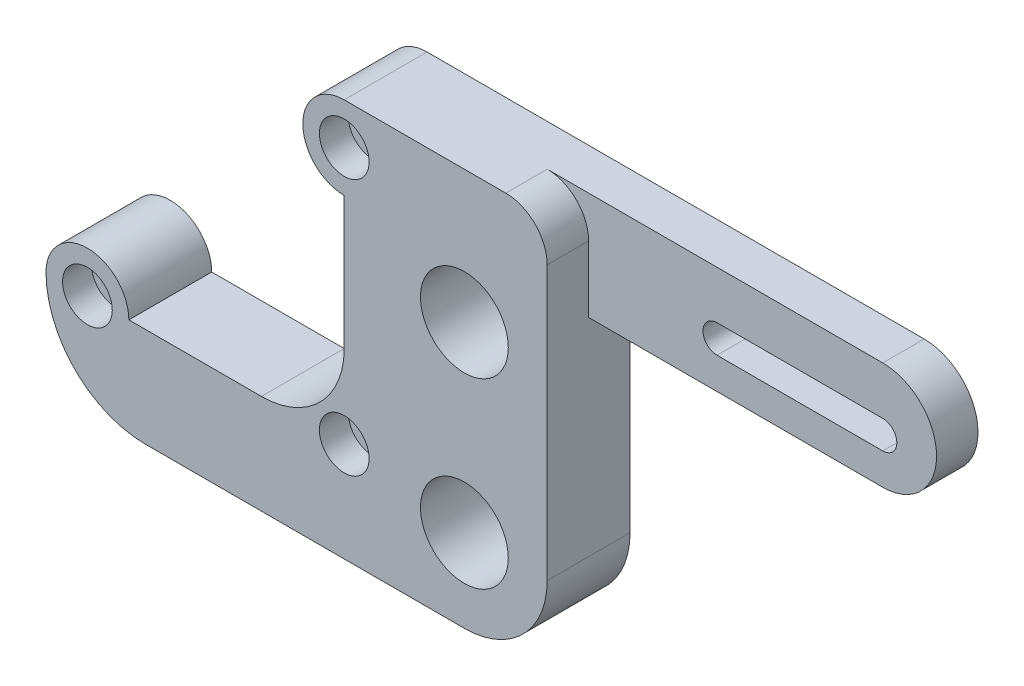
ISO-10303-21;
HEADER;
FILE_DESCRIPTION(('STEP AP214'),'2;1');
FILE_NAME('part.step','',(''),(''),'','','');
FILE_SCHEMA(('AUTOMOTIVE_DESIGN { 1 0 10303 214 1 1 1 1 }'));
ENDSEC;
DATA;
#1=APPLICATION_CONTEXT('core data for automotive mechanical design processes');
#2=APPLICATION_PROTOCOL_DEFINITION('international standard','automotive_design',2000,#1);
#3=PRODUCT_CONTEXT('',#1,'mechanical');
#4=PRODUCT('Part','Part','',(#3));
#5=PRODUCT_RELATED_PRODUCT_CATEGORY('part','',(#4));
#6=PRODUCT_DEFINITION_FORMATION('','',#4);
#7=PRODUCT_DEFINITION_CONTEXT('part definition',#1,'design');
#8=PRODUCT_DEFINITION('design','',#6,#7);
#9=PRODUCT_DEFINITION_SHAPE('','',#8);
#10=(LENGTH_UNIT() NAMED_UNIT(*) SI_UNIT(.MILLI.,.METRE.));
#11=(NAMED_UNIT(*) PLANE_ANGLE_UNIT() SI_UNIT($,.RADIAN.));
#12=(NAMED_UNIT(*) SI_UNIT($,.STERADIAN.) SOLID_ANGLE_UNIT());
#13=UNCERTAINTY_MEASURE_WITH_UNIT(LENGTH_MEASURE(1.E-05),#10,'distance_accuracy_value','');
#14=(GEOMETRIC_REPRESENTATION_CONTEXT(3) GLOBAL_UNCERTAINTY_ASSIGNED_CONTEXT((#13)) GLOBAL_UNIT_ASSIGNED_CONTEXT((#10,
#11,#12)) REPRESENTATION_CONTEXT('',''));
#15=CARTESIAN_POINT('',(0.,0.,0.));
#16=DIRECTION('',(0.,0.,1.));
#17=DIRECTION('',(1.,0.,0.));
#18=AXIS2_PLACEMENT_3D('',#15,#16,#17);
#19=CARTESIAN_POINT('',(0.,5.,10.));
#20=DIRECTION('',(0.,1.,0.));
#21=DIRECTION('',(0.,0.,1.));
#22=AXIS2_PLACEMENT_3D('',#19,#20,#21);
#23=PLANE('',#22);
#24=DIRECTION('',(1.,0.,0.));
#25=VECTOR('',#24,1.);
#26=CARTESIAN_POINT('',(0.,5.,10.));
#27=LINE('',#26,#25);
#28=CARTESIAN_POINT('',(0.,5.,10.));
#29=VERTEX_POINT('',#28);
#30=CARTESIAN_POINT('',(19.5,5.,10.));
#31=VERTEX_POINT('',#30);
#32=EDGE_CURVE('E252',#29,#31,#27,.T.);
#33=ORIENTED_EDGE('',*,*,#32,.T.);
#34=DIRECTION('',(0.,0.,1.));
#35=VECTOR('',#34,1.);
#36=CARTESIAN_POINT('',(19.5,5.,5.));
#37=LINE('',#36,#35);
#38=CARTESIAN_POINT('',(19.5,5.,5.));
#39=VERTEX_POINT('',#38);
#40=EDGE_CURVE('E57',#39,#31,#37,.T.);
#41=ORIENTED_EDGE('',*,*,#40,.F.);
#42=DIRECTION('',(-1.,0.,0.));
#43=VECTOR('',#42,1.);
#44=CARTESIAN_POINT('',(19.5,5.,5.));
#45=LINE('',#44,#43);
#46=CARTESIAN_POINT('',(60.,5.,5.));
#47=VERTEX_POINT('',#46);
#48=EDGE_CURVE('E180',#47,#39,#45,.T.);
#49=ORIENTED_EDGE('',*,*,#48,.F.);
#50=DIRECTION('',(0.,0.,-1.));
#51=VECTOR('',#50,1.);
#52=CARTESIAN_POINT('',(60.,5.,10.));
#53=LINE('',#52,#51);
#54=CARTESIAN_POINT('',(60.,5.,0.));
#55=VERTEX_POINT('',#54);
#56=EDGE_CURVE('E179',#47,#55,#53,.T.);
#57=ORIENTED_EDGE('',*,*,#56,.T.);
#58=DIRECTION('',(1.,0.,0.));
#59=VECTOR('',#58,1.);
#60=CARTESIAN_POINT('',(0.,5.,0.));
#61=LINE('',#60,#59);
#62=CARTESIAN_POINT('',(0.,5.,0.));
#63=VERTEX_POINT('',#62);
#64=EDGE_CURVE('E307',#63,#55,#61,.T.);
#65=ORIENTED_EDGE('',*,*,#64,.F.);
#66=DIRECTION('',(0.,0.,-1.));
#67=VECTOR('',#66,1.);
#68=CARTESIAN_POINT('',(0.,5.,10.));
#69=LINE('',#68,#67);
#70=EDGE_CURVE('E190',#29,#63,#69,.T.);
#71=ORIENTED_EDGE('',*,*,#70,.F.);
#72=EDGE_LOOP('',(#33,#41,#49,#57,#65,#71));
#73=FACE_BOUND('',#72,.T.);
#74=ADVANCED_FACE('F35',(#73),#23,.T.);
#75=CARTESIAN_POINT('',(0.,-31.,10.));
#76=DIRECTION('',(0.,0.,-1.));
#77=DIRECTION('',(-1.,0.,0.));
#78=AXIS2_PLACEMENT_3D('',#75,#76,#77);
#79=CYLINDRICAL_SURFACE('',#78,1.8);
#80=CARTESIAN_POINT('',(0.,-31.,0.));
#81=DIRECTION('',(0.,0.,1.));
#82=DIRECTION('',(1.,0.,0.));
#83=AXIS2_PLACEMENT_3D('',#80,#81,#82);
#84=CIRCLE('',#83,1.8);
#85=CARTESIAN_POINT('',(1.8,-31.,0.));
#86=VERTEX_POINT('',#85);
#87=EDGE_CURVE('E283',#86,#86,#84,.T.);
#88=ORIENTED_EDGE('',*,*,#87,.F.);
#89=EDGE_LOOP('',(#88));
#90=FACE_BOUND('',#89,.T.);
#91=CARTESIAN_POINT('',(0.,-31.,6.5));
#92=DIRECTION('',(0.,0.,1.));
#93=DIRECTION('',(1.,0.,0.));
#94=AXIS2_PLACEMENT_3D('',#91,#92,#93);
#95=CIRCLE('',#94,1.8);
#96=CARTESIAN_POINT('',(1.8,-31.,6.5));
#97=VERTEX_POINT('',#96);
#98=EDGE_CURVE('E218',#97,#97,#95,.T.);
#99=ORIENTED_EDGE('',*,*,#98,.T.);
#100=EDGE_LOOP('',(#99));
#101=FACE_BOUND('',#100,.T.);
#102=ADVANCED_FACE('F442',(#90,#101),#79,.F.);
#103=CARTESIAN_POINT('',(0.,0.,10.));
#104=DIRECTION('',(0.,0.,-1.));
#105=DIRECTION('',(-1.,0.,0.));
#106=AXIS2_PLACEMENT_3D('',#103,#104,#105);
#107=CYLINDRICAL_SURFACE('',#106,1.8);
#108=CARTESIAN_POINT('',(0.,0.,0.));
#109=DIRECTION('',(0.,0.,1.));
#110=DIRECTION('',(1.,0.,0.));
#111=AXIS2_PLACEMENT_3D('',#108,#109,#110);
#112=CIRCLE('',#111,1.8);
#113=CARTESIAN_POINT('',(1.8,0.,0.));
#114=VERTEX_POINT('',#113);
#115=EDGE_CURVE('E214',#114,#114,#112,.T.);
#116=ORIENTED_EDGE('',*,*,#115,.F.);
#117=EDGE_LOOP('',(#116));
#118=FACE_BOUND('',#117,.T.);
#119=CARTESIAN_POINT('',(0.,0.,6.5));
#120=DIRECTION('',(0.,0.,1.));
#121=DIRECTION('',(1.,0.,0.));
#122=AXIS2_PLACEMENT_3D('',#119,#120,#121);
#123=CIRCLE('',#122,1.8);
#124=CARTESIAN_POINT('',(1.8,0.,6.5));
#125=VERTEX_POINT('',#124);
#126=EDGE_CURVE('E216',#125,#125,#123,.T.);
#127=ORIENTED_EDGE('',*,*,#126,.T.);
#128=EDGE_LOOP('',(#127));
#129=FACE_BOUND('',#128,.T.);
#130=ADVANCED_FACE('F37',(#118,#129),#107,.F.);
#131=CARTESIAN_POINT('',(-31.,-31.,10.));
#132=DIRECTION('',(0.,0.,-1.));
#133=DIRECTION('',(-1.,0.,0.));
#134=AXIS2_PLACEMENT_3D('',#131,#132,#133);
#135=CYLINDRICAL_SURFACE('',#134,1.8);
#136=CARTESIAN_POINT('',(-31.,-31.,0.));
#137=DIRECTION('',(0.,0.,1.));
#138=DIRECTION('',(1.,0.,0.));
#139=AXIS2_PLACEMENT_3D('',#136,#137,#138);
#140=CIRCLE('',#139,1.8);
#141=CARTESIAN_POINT('',(-29.2,-31.,0.));
#142=VERTEX_POINT('',#141);
#143=EDGE_CURVE('E286',#142,#142,#140,.T.);
#144=ORIENTED_EDGE('',*,*,#143,.F.);
#145=EDGE_LOOP('',(#144));
#146=FACE_BOUND('',#145,.T.);
#147=CARTESIAN_POINT('',(-31.,-31.,6.5));
#148=DIRECTION('',(0.,0.,1.));
#149=DIRECTION('',(1.,0.,0.));
#150=AXIS2_PLACEMENT_3D('',#147,#148,#149);
#151=CIRCLE('',#150,1.8);
#152=CARTESIAN_POINT('',(-29.2,-31.,6.5));
#153=VERTEX_POINT('',#152);
#154=EDGE_CURVE('E211',#153,#153,#151,.T.);
#155=ORIENTED_EDGE('',*,*,#154,.T.);
#156=EDGE_LOOP('',(#155));
#157=FACE_BOUND('',#156,.T.);
#158=ADVANCED_FACE('F425',(#146,#157),#135,.F.);
#159=CARTESIAN_POINT('',(-31.,-31.,10.));
#160=DIRECTION('',(0.,0.,-1.));
#161=DIRECTION('',(-1.,0.,0.));
#162=AXIS2_PLACEMENT_3D('',#159,#160,#161);
#163=CYLINDRICAL_SURFACE('',#162,5.00000000000001);
#164=CARTESIAN_POINT('',(-31.,-31.,0.));
#165=DIRECTION('',(0.,0.,1.));
#166=DIRECTION('',(1.,0.,0.));
#167=AXIS2_PLACEMENT_3D('',#164,#165,#166);
#168=CIRCLE('',#167,5.00000000000001);
#169=CARTESIAN_POINT('',(-26.,-31.,0.));
#170=VERTEX_POINT('',#169);
#171=CARTESIAN_POINT('',(-36.,-31.,0.));
#172=VERTEX_POINT('',#171);
#173=EDGE_CURVE('E289',#170,#172,#168,.T.);
#174=ORIENTED_EDGE('',*,*,#173,.T.);
#175=DIRECTION('',(0.,0.,-1.));
#176=VECTOR('',#175,1.);
#177=CARTESIAN_POINT('',(-36.,-31.,10.));
#178=LINE('',#177,#176);
#179=CARTESIAN_POINT('',(-36.,-31.,10.));
#180=VERTEX_POINT('',#179);
#181=EDGE_CURVE('E43',#180,#172,#178,.T.);
#182=ORIENTED_EDGE('',*,*,#181,.F.);
#183=CARTESIAN_POINT('',(-31.,-31.,10.));
#184=DIRECTION('',(0.,0.,1.));
#185=DIRECTION('',(1.,0.,0.));
#186=AXIS2_PLACEMENT_3D('',#183,#184,#185);
#187=CIRCLE('',#186,5.00000000000001);
#188=CARTESIAN_POINT('',(-26.,-31.,10.));
#189=VERTEX_POINT('',#188);
#190=EDGE_CURVE('E239',#189,#180,#187,.T.);
#191=ORIENTED_EDGE('',*,*,#190,.F.);
#192=DIRECTION('',(0.,0.,-1.));
#193=VECTOR('',#192,1.);
#194=CARTESIAN_POINT('',(-26.,-31.,10.));
#195=LINE('',#194,#193);
#196=EDGE_CURVE('E210',#189,#170,#195,.T.);
#197=ORIENTED_EDGE('',*,*,#196,.T.);
#198=EDGE_LOOP('',(#174,#182,#191,#197));
#199=FACE_BOUND('',#198,.T.);
#200=ADVANCED_FACE('F359',(#199),#163,.T.);
#201=CARTESIAN_POINT('',(-24.,-31.,10.));
#202=DIRECTION('',(0.,0.,-1.));
#203=DIRECTION('',(-1.,0.,0.));
#204=AXIS2_PLACEMENT_3D('',#201,#202,#203);
#205=CYLINDRICAL_SURFACE('',#204,12.);
#206=CARTESIAN_POINT('',(-24.,-31.,0.));
#207=DIRECTION('',(0.,0.,1.));
#208=DIRECTION('',(1.,0.,0.));
#209=AXIS2_PLACEMENT_3D('',#206,#207,#208);
#210=CIRCLE('',#209,12.);
#211=CARTESIAN_POINT('',(-24.,-43.,0.));
#212=VERTEX_POINT('',#211);
#213=EDGE_CURVE('E292',#172,#212,#210,.T.);
#214=ORIENTED_EDGE('',*,*,#213,.T.);
#215=DIRECTION('',(0.,0.,-1.));
#216=VECTOR('',#215,1.);
#217=CARTESIAN_POINT('',(-24.,-43.,10.));
#218=LINE('',#217,#216);
#219=CARTESIAN_POINT('',(-24.,-43.,10.));
#220=VERTEX_POINT('',#219);
#221=EDGE_CURVE('E197',#220,#212,#218,.T.);
#222=ORIENTED_EDGE('',*,*,#221,.F.);
#223=CARTESIAN_POINT('',(-24.,-31.,10.));
#224=DIRECTION('',(0.,0.,1.));
#225=DIRECTION('',(1.,0.,0.));
#226=AXIS2_PLACEMENT_3D('',#223,#224,#225);
#227=CIRCLE('',#226,12.);
#228=EDGE_CURVE('E242',#180,#220,#227,.T.);
#229=ORIENTED_EDGE('',*,*,#228,.F.);
#230=ORIENTED_EDGE('',*,*,#181,.T.);
#231=EDGE_LOOP('',(#214,#222,#229,#230));
#232=FACE_BOUND('',#231,.T.);
#233=ADVANCED_FACE('F356',(#232),#205,.T.);
#234=CARTESIAN_POINT('',(0.,-43.,10.));
#235=DIRECTION('',(0.,-1.,0.));
#236=DIRECTION('',(1.,0.,0.));
#237=AXIS2_PLACEMENT_3D('',#234,#235,#236);
#238=PLANE('',#237);
#239=DIRECTION('',(-1.,0.,0.));
#240=VECTOR('',#239,1.);
#241=CARTESIAN_POINT('',(0.,-43.,0.));
#242=LINE('',#241,#240);
#243=CARTESIAN_POINT('',(14.5,-43.,0.));
#244=VERTEX_POINT('',#243);
#245=EDGE_CURVE('E295',#244,#212,#242,.T.);
#246=ORIENTED_EDGE('',*,*,#245,.F.);
#247=DIRECTION('',(0.,0.,-1.));
#248=VECTOR('',#247,1.);
#249=CARTESIAN_POINT('',(14.5,-43.,10.));
#250=LINE('',#249,#248);
#251=CARTESIAN_POINT('',(14.5,-43.,10.));
#252=VERTEX_POINT('',#251);
#253=EDGE_CURVE('E195',#252,#244,#250,.T.);
#254=ORIENTED_EDGE('',*,*,#253,.F.);
#255=DIRECTION('',(-1.,0.,0.));
#256=VECTOR('',#255,1.);
#257=CARTESIAN_POINT('',(0.,-43.,10.));
#258=LINE('',#257,#256);
#259=EDGE_CURVE('E244',#252,#220,#258,.T.);
#260=ORIENTED_EDGE('',*,*,#259,.T.);
#261=ORIENTED_EDGE('',*,*,#221,.T.);
#262=EDGE_LOOP('',(#246,#254,#260,#261));
#263=FACE_BOUND('',#262,.T.);
#264=ADVANCED_FACE('F351',(#263),#238,.T.);
#265=CARTESIAN_POINT('',(14.5,-33.,10.));
#266=DIRECTION('',(0.,0.,-1.));
#267=DIRECTION('',(-1.,0.,0.));
#268=AXIS2_PLACEMENT_3D('',#265,#266,#267);
#269=CYLINDRICAL_SURFACE('',#268,10.);
#270=CARTESIAN_POINT('',(14.5,-33.,0.));
#271=DIRECTION('',(0.,0.,1.));
#272=DIRECTION('',(1.,0.,0.));
#273=AXIS2_PLACEMENT_3D('',#270,#271,#272);
#274=CIRCLE('',#273,10.);
#275=CARTESIAN_POINT('',(24.5,-33.,0.));
#276=VERTEX_POINT('',#275);
#277=EDGE_CURVE('E298',#244,#276,#274,.T.);
#278=ORIENTED_EDGE('',*,*,#277,.T.);
#279=DIRECTION('',(0.,0.,-1.));
#280=VECTOR('',#279,1.);
#281=CARTESIAN_POINT('',(24.5,-33.,10.));
#282=LINE('',#281,#280);
#283=CARTESIAN_POINT('',(24.5,-33.,10.));
#284=VERTEX_POINT('',#283);
#285=EDGE_CURVE('E188',#284,#276,#282,.T.);
#286=ORIENTED_EDGE('',*,*,#285,.F.);
#287=CARTESIAN_POINT('',(14.5,-33.,10.));
#288=DIRECTION('',(0.,0.,1.));
#289=DIRECTION('',(1.,0.,0.));
#290=AXIS2_PLACEMENT_3D('',#287,#288,#289);
#291=CIRCLE('',#290,10.);
#292=EDGE_CURVE('E247',#252,#284,#291,.T.);
#293=ORIENTED_EDGE('',*,*,#292,.F.);
#294=ORIENTED_EDGE('',*,*,#253,.T.);
#295=EDGE_LOOP('',(#278,#286,#293,#294));
#296=FACE_BOUND('',#295,.T.);
#297=ADVANCED_FACE('F348',(#296),#269,.T.);
#298=CARTESIAN_POINT('',(24.5,0.,10.));
#299=DIRECTION('',(1.,0.,0.));
#300=DIRECTION('',(0.,0.,-1.));
#301=AXIS2_PLACEMENT_3D('',#298,#299,#300);
#302=PLANE('',#301);
#303=DIRECTION('',(0.,-1.,0.));
#304=VECTOR('',#303,1.);
#305=CARTESIAN_POINT('',(24.5,0.,0.));
#306=LINE('',#305,#304);
#307=CARTESIAN_POINT('',(24.5,-8.,0.));
#308=VERTEX_POINT('',#307);
#309=EDGE_CURVE('E301',#308,#276,#306,.T.);
#310=ORIENTED_EDGE('',*,*,#309,.F.);
#311=DIRECTION('',(0.,0.,-1.));
#312=VECTOR('',#311,1.);
#313=CARTESIAN_POINT('',(24.5,-8.,10.));
#314=LINE('',#313,#312);
#315=CARTESIAN_POINT('',(24.5,-8.,5.));
#316=VERTEX_POINT('',#315);
#317=EDGE_CURVE('E186',#316,#308,#314,.T.);
#318=ORIENTED_EDGE('',*,*,#317,.F.);
#319=DIRECTION('',(0.,-1.,0.));
#320=VECTOR('',#319,1.);
#321=CARTESIAN_POINT('',(24.5,-8.,5.));
#322=LINE('',#321,#320);
#323=CARTESIAN_POINT('',(24.5,0.,5.));
#324=VERTEX_POINT('',#323);
#325=EDGE_CURVE('E167',#324,#316,#322,.T.);
#326=ORIENTED_EDGE('',*,*,#325,.F.);
#327=DIRECTION('',(0.,0.,1.));
#328=VECTOR('',#327,1.);
#329=CARTESIAN_POINT('',(24.5,0.,5.));
#330=LINE('',#329,#328);
#331=CARTESIAN_POINT('',(24.5,0.,10.));
#332=VERTEX_POINT('',#331);
#333=EDGE_CURVE('E375',#324,#332,#330,.T.);
#334=ORIENTED_EDGE('',*,*,#333,.T.);
#335=DIRECTION('',(0.,-1.,0.));
#336=VECTOR('',#335,1.);
#337=CARTESIAN_POINT('',(24.5,0.,10.));
#338=LINE('',#337,#336);
#339=EDGE_CURVE('E249',#332,#284,#338,.T.);
#340=ORIENTED_EDGE('',*,*,#339,.T.);
#341=ORIENTED_EDGE('',*,*,#285,.T.);
#342=EDGE_LOOP('',(#310,#318,#326,#334,#340,#341));
#343=FACE_BOUND('',#342,.T.);
#344=ADVANCED_FACE('F343',(#343),#302,.T.);
#345=CARTESIAN_POINT('',(0.,-8.,10.));
#346=DIRECTION('',(0.,-1.,0.));
#347=DIRECTION('',(1.,0.,0.));
#348=AXIS2_PLACEMENT_3D('',#345,#346,#347);
#349=PLANE('',#348);
#350=DIRECTION('',(1.,0.,0.));
#351=VECTOR('',#350,1.);
#352=CARTESIAN_POINT('',(24.5,-8.,5.));
#353=LINE('',#352,#351);
#354=CARTESIAN_POINT('',(60.,-8.,5.));
#355=VERTEX_POINT('',#354);
#356=EDGE_CURVE('E159',#316,#355,#353,.T.);
#357=ORIENTED_EDGE('',*,*,#356,.F.);
#358=ORIENTED_EDGE('',*,*,#317,.T.);
#359=DIRECTION('',(-1.,0.,0.));
#360=VECTOR('',#359,1.);
#361=CARTESIAN_POINT('',(0.,-8.,0.));
#362=LINE('',#361,#360);
#363=CARTESIAN_POINT('',(60.,-8.,0.));
#364=VERTEX_POINT('',#363);
#365=EDGE_CURVE('E185',#364,#308,#362,.T.);
#366=ORIENTED_EDGE('',*,*,#365,.F.);
#367=DIRECTION('',(0.,0.,-1.));
#368=VECTOR('',#367,1.);
#369=CARTESIAN_POINT('',(60.,-8.,10.));
#370=LINE('',#369,#368);
#371=EDGE_CURVE('E177',#355,#364,#370,.T.);
#372=ORIENTED_EDGE('',*,*,#371,.F.);
#373=EDGE_LOOP('',(#357,#358,#366,#372));
#374=FACE_BOUND('',#373,.T.);
#375=ADVANCED_FACE('F183',(#374),#349,.T.);
#376=CARTESIAN_POINT('',(60.,-1.5,10.));
#377=DIRECTION('',(0.,0.,-1.));
#378=DIRECTION('',(-1.,0.,0.));
#379=AXIS2_PLACEMENT_3D('',#376,#377,#378);
#380=CYLINDRICAL_SURFACE('',#379,6.5);
#381=ORIENTED_EDGE('',*,*,#56,.F.);
#382=CARTESIAN_POINT('',(60.,-1.5,5.));
#383=DIRECTION('',(0.,0.,1.));
#384=DIRECTION('',(-1.,0.,0.));
#385=AXIS2_PLACEMENT_3D('',#382,#383,#384);
#386=CIRCLE('',#385,6.5);
#387=EDGE_CURVE('E163',#355,#47,#386,.T.);
#388=ORIENTED_EDGE('',*,*,#387,.F.);
#389=ORIENTED_EDGE('',*,*,#371,.T.);
#390=CARTESIAN_POINT('',(60.,-1.5,0.));
#391=DIRECTION('',(0.,0.,1.));
#392=DIRECTION('',(1.,0.,0.));
#393=AXIS2_PLACEMENT_3D('',#390,#391,#392);
#394=CIRCLE('',#393,6.5);
#395=EDGE_CURVE('E305',#364,#55,#394,.T.);
#396=ORIENTED_EDGE('',*,*,#395,.T.);
#397=EDGE_LOOP('',(#381,#388,#389,#396));
#398=FACE_BOUND('',#397,.T.);
#399=ADVANCED_FACE('F175',(#398),#380,.T.);
#400=CARTESIAN_POINT('',(0.,0.,10.));
#401=DIRECTION('',(0.,0.,-1.));
#402=DIRECTION('',(-1.,0.,0.));
#403=AXIS2_PLACEMENT_3D('',#400,#401,#402);
#404=CYLINDRICAL_SURFACE('',#403,5.);
#405=CARTESIAN_POINT('',(0.,0.,0.));
#406=DIRECTION('',(0.,0.,1.));
#407=DIRECTION('',(1.,0.,0.));
#408=AXIS2_PLACEMENT_3D('',#405,#406,#407);
#409=CIRCLE('',#408,5.);
#410=CARTESIAN_POINT('',(0.,-5.,0.));
#411=VERTEX_POINT('',#410);
#412=EDGE_CURVE('E310',#63,#411,#409,.T.);
#413=ORIENTED_EDGE('',*,*,#412,.T.);
#414=DIRECTION('',(0.,0.,-1.));
#415=VECTOR('',#414,1.);
#416=CARTESIAN_POINT('',(0.,-5.,10.));
#417=LINE('',#416,#415);
#418=CARTESIAN_POINT('',(0.,-5.,10.));
#419=VERTEX_POINT('',#418);
#420=EDGE_CURVE('E325',#419,#411,#417,.T.);
#421=ORIENTED_EDGE('',*,*,#420,.F.);
#422=CARTESIAN_POINT('',(0.,0.,10.));
#423=DIRECTION('',(0.,0.,1.));
#424=DIRECTION('',(1.,0.,0.));
#425=AXIS2_PLACEMENT_3D('',#422,#423,#424);
#426=CIRCLE('',#425,5.);
#427=EDGE_CURVE('E255',#29,#419,#426,.T.);
#428=ORIENTED_EDGE('',*,*,#427,.F.);
#429=ORIENTED_EDGE('',*,*,#70,.T.);
#430=EDGE_LOOP('',(#413,#421,#428,#429));
#431=FACE_BOUND('',#430,.T.);
#432=ADVANCED_FACE('F330',(#431),#404,.T.);
#433=CARTESIAN_POINT('',(0.,0.,10.));
#434=DIRECTION('',(1.,0.,0.));
#435=DIRECTION('',(0.,1.,0.));
#436=AXIS2_PLACEMENT_3D('',#433,#434,#435);
#437=PLANE('',#436);
#438=DIRECTION('',(0.,-1.,0.));
#439=VECTOR('',#438,1.);
#440=CARTESIAN_POINT('',(0.,0.,0.));
#441=LINE('',#440,#439);
#442=CARTESIAN_POINT('',(0.,-21.,0.));
#443=VERTEX_POINT('',#442);
#444=EDGE_CURVE('E312',#411,#443,#441,.T.);
#445=ORIENTED_EDGE('',*,*,#444,.T.);
#446=DIRECTION('',(0.,0.,-1.));
#447=VECTOR('',#446,1.);
#448=CARTESIAN_POINT('',(0.,-21.,10.));
#449=LINE('',#448,#447);
#450=CARTESIAN_POINT('',(0.,-21.,10.));
#451=VERTEX_POINT('',#450);
#452=EDGE_CURVE('E323',#451,#443,#449,.T.);
#453=ORIENTED_EDGE('',*,*,#452,.F.);
#454=DIRECTION('',(0.,-1.,0.));
#455=VECTOR('',#454,1.);
#456=CARTESIAN_POINT('',(0.,0.,10.));
#457=LINE('',#456,#455);
#458=EDGE_CURVE('E257',#419,#451,#457,.T.);
#459=ORIENTED_EDGE('',*,*,#458,.F.);
#460=ORIENTED_EDGE('',*,*,#420,.T.);
#461=EDGE_LOOP('',(#445,#453,#459,#460));
#462=FACE_BOUND('',#461,.T.);
#463=ADVANCED_FACE('F371',(#462),#437,.F.);
#464=CARTESIAN_POINT('',(-10.,-21.,10.));
#465=DIRECTION('',(0.,0.,-1.));
#466=DIRECTION('',(-1.,0.,0.));
#467=AXIS2_PLACEMENT_3D('',#464,#465,#466);
#468=CYLINDRICAL_SURFACE('',#467,10.);
#469=CARTESIAN_POINT('',(-10.,-21.,0.));
#470=DIRECTION('',(0.,0.,1.));
#471=DIRECTION('',(1.,0.,0.));
#472=AXIS2_PLACEMENT_3D('',#469,#470,#471);
#473=CIRCLE('',#472,10.);
#474=CARTESIAN_POINT('',(-10.,-31.,0.));
#475=VERTEX_POINT('',#474);
#476=EDGE_CURVE('E315',#475,#443,#473,.T.);
#477=ORIENTED_EDGE('',*,*,#476,.F.);
#478=DIRECTION('',(0.,0.,-1.));
#479=VECTOR('',#478,1.);
#480=CARTESIAN_POINT('',(-10.,-31.,10.));
#481=LINE('',#480,#479);
#482=CARTESIAN_POINT('',(-10.,-31.,10.));
#483=VERTEX_POINT('',#482);
#484=EDGE_CURVE('E321',#483,#475,#481,.T.);
#485=ORIENTED_EDGE('',*,*,#484,.F.);
#486=CARTESIAN_POINT('',(-10.,-21.,10.));
#487=DIRECTION('',(0.,0.,1.));
#488=DIRECTION('',(1.,0.,0.));
#489=AXIS2_PLACEMENT_3D('',#486,#487,#488);
#490=CIRCLE('',#489,10.);
#491=EDGE_CURVE('E259',#483,#451,#490,.T.);
#492=ORIENTED_EDGE('',*,*,#491,.T.);
#493=ORIENTED_EDGE('',*,*,#452,.T.);
#494=EDGE_LOOP('',(#477,#485,#492,#493));
#495=FACE_BOUND('',#494,.T.);
#496=ADVANCED_FACE('F367',(#495),#468,.F.);
#497=CARTESIAN_POINT('',(40.,-2.5,10.));
#498=DIRECTION('',(0.,0.,-1.));
#499=DIRECTION('',(-1.,0.,0.));
#500=AXIS2_PLACEMENT_3D('',#497,#498,#499);
#501=CYLINDRICAL_SURFACE('',#500,1.7);
#502=CARTESIAN_POINT('',(40.,-2.5,5.));
#503=DIRECTION('',(0.,0.,-1.));
#504=DIRECTION('',(-1.,0.,0.));
#505=AXIS2_PLACEMENT_3D('',#502,#503,#504);
#506=CIRCLE('',#505,1.7);
#507=CARTESIAN_POINT('',(40.,-4.2,5.));
#508=VERTEX_POINT('',#507);
#509=CARTESIAN_POINT('',(40.,-0.800000000000001,5.));
#510=VERTEX_POINT('',#509);
#511=EDGE_CURVE('E385',#508,#510,#506,.T.);
#512=ORIENTED_EDGE('',*,*,#511,.F.);
#513=DIRECTION('',(0.,0.,-1.));
#514=VECTOR('',#513,1.);
#515=CARTESIAN_POINT('',(40.,-4.2,10.));
#516=LINE('',#515,#514);
#517=CARTESIAN_POINT('',(40.,-4.2,0.));
#518=VERTEX_POINT('',#517);
#519=EDGE_CURVE('E201',#508,#518,#516,.T.);
#520=ORIENTED_EDGE('',*,*,#519,.T.);
#521=CARTESIAN_POINT('',(40.,-2.5,0.));
#522=DIRECTION('',(0.,0.,1.));
#523=DIRECTION('',(1.,0.,0.));
#524=AXIS2_PLACEMENT_3D('',#521,#522,#523);
#525=CIRCLE('',#524,1.7);
#526=CARTESIAN_POINT('',(40.,-0.800000000000001,0.));
#527=VERTEX_POINT('',#526);
#528=EDGE_CURVE('E265',#527,#518,#525,.T.);
#529=ORIENTED_EDGE('',*,*,#528,.F.);
#530=DIRECTION('',(0.,0.,-1.));
#531=VECTOR('',#530,1.);
#532=CARTESIAN_POINT('',(40.,-0.800000000000001,10.));
#533=LINE('',#532,#531);
#534=EDGE_CURVE('E208',#510,#527,#533,.T.);
#535=ORIENTED_EDGE('',*,*,#534,.F.);
#536=EDGE_LOOP('',(#512,#520,#529,#535));
#537=FACE_BOUND('',#536,.T.);
#538=ADVANCED_FACE('F478',(#537),#501,.F.);
#539=CARTESIAN_POINT('',(0.,-0.800000000000006,10.));
#540=DIRECTION('',(0.,-1.,0.));
#541=DIRECTION('',(1.,0.,0.));
#542=AXIS2_PLACEMENT_3D('',#539,#540,#541);
#543=PLANE('',#542);
#544=DIRECTION('',(1.,0.,0.));
#545=VECTOR('',#544,1.);
#546=CARTESIAN_POINT('',(0.,-0.800000000000006,5.));
#547=LINE('',#546,#545);
#548=CARTESIAN_POINT('',(60.,-0.799999999999999,5.));
#549=VERTEX_POINT('',#548);
#550=EDGE_CURVE('E383',#510,#549,#547,.T.);
#551=ORIENTED_EDGE('',*,*,#550,.F.);
#552=ORIENTED_EDGE('',*,*,#534,.T.);
#553=DIRECTION('',(-1.,0.,0.));
#554=VECTOR('',#553,1.);
#555=CARTESIAN_POINT('',(0.,-0.800000000000006,0.));
#556=LINE('',#555,#554);
#557=CARTESIAN_POINT('',(60.,-0.799999999999998,0.));
#558=VERTEX_POINT('',#557);
#559=EDGE_CURVE('E268',#558,#527,#556,.T.);
#560=ORIENTED_EDGE('',*,*,#559,.F.);
#561=DIRECTION('',(0.,0.,-1.));
#562=VECTOR('',#561,1.);
#563=CARTESIAN_POINT('',(60.,-0.799999999999998,10.));
#564=LINE('',#563,#562);
#565=EDGE_CURVE('E206',#549,#558,#564,.T.);
#566=ORIENTED_EDGE('',*,*,#565,.F.);
#567=EDGE_LOOP('',(#551,#552,#560,#566));
#568=FACE_BOUND('',#567,.T.);
#569=ADVANCED_FACE('F475',(#568),#543,.T.);
#570=CARTESIAN_POINT('',(60.,-2.5,10.));
#571=DIRECTION('',(0.,0.,-1.));
#572=DIRECTION('',(-1.,0.,0.));
#573=AXIS2_PLACEMENT_3D('',#570,#571,#572);
#574=CYLINDRICAL_SURFACE('',#573,1.7);
#575=CARTESIAN_POINT('',(60.,-2.5,5.));
#576=DIRECTION('',(0.,0.,-1.));
#577=DIRECTION('',(-1.,0.,0.));
#578=AXIS2_PLACEMENT_3D('',#575,#576,#577);
#579=CIRCLE('',#578,1.7);
#580=CARTESIAN_POINT('',(60.,-4.2,5.));
#581=VERTEX_POINT('',#580);
#582=EDGE_CURVE('E50',#549,#581,#579,.T.);
#583=ORIENTED_EDGE('',*,*,#582,.F.);
#584=ORIENTED_EDGE('',*,*,#565,.T.);
#585=CARTESIAN_POINT('',(60.,-2.5,0.));
#586=DIRECTION('',(0.,0.,1.));
#587=DIRECTION('',(1.,0.,0.));
#588=AXIS2_PLACEMENT_3D('',#585,#586,#587);
#589=CIRCLE('',#588,1.7);
#590=CARTESIAN_POINT('',(60.,-4.2,0.));
#591=VERTEX_POINT('',#590);
#592=EDGE_CURVE('E271',#591,#558,#589,.T.);
#593=ORIENTED_EDGE('',*,*,#592,.F.);
#594=DIRECTION('',(0.,0.,-1.));
#595=VECTOR('',#594,1.);
#596=CARTESIAN_POINT('',(60.,-4.2,10.));
#597=LINE('',#596,#595);
#598=EDGE_CURVE('E203',#581,#591,#597,.T.);
#599=ORIENTED_EDGE('',*,*,#598,.F.);
#600=EDGE_LOOP('',(#583,#584,#593,#599));
#601=FACE_BOUND('',#600,.T.);
#602=ADVANCED_FACE('F412',(#601),#574,.F.);
#603=CARTESIAN_POINT('',(14.5,-11.,10.));
#604=DIRECTION('',(0.,0.,-1.));
#605=DIRECTION('',(-1.,0.,0.));
#606=AXIS2_PLACEMENT_3D('',#603,#604,#605);
#607=CYLINDRICAL_SURFACE('',#606,5.3);
#608=CARTESIAN_POINT('',(14.5,-11.,10.));
#609=DIRECTION('',(0.,0.,1.));
#610=DIRECTION('',(1.,0.,0.));
#611=AXIS2_PLACEMENT_3D('',#608,#609,#610);
#612=CIRCLE('',#611,5.3);
#613=CARTESIAN_POINT('',(19.8,-11.,10.));
#614=VERTEX_POINT('',#613);
#615=EDGE_CURVE('E235',#614,#614,#612,.T.);
#616=ORIENTED_EDGE('',*,*,#615,.T.);
#617=EDGE_LOOP('',(#616));
#618=FACE_BOUND('',#617,.T.);
#619=CARTESIAN_POINT('',(14.5,-11.,0.));
#620=DIRECTION('',(0.,0.,1.));
#621=DIRECTION('',(1.,0.,0.));
#622=AXIS2_PLACEMENT_3D('',#619,#620,#621);
#623=CIRCLE('',#622,5.3);
#624=CARTESIAN_POINT('',(19.8,-11.,0.));
#625=VERTEX_POINT('',#624);
#626=EDGE_CURVE('E280',#625,#625,#623,.T.);
#627=ORIENTED_EDGE('',*,*,#626,.F.);
#628=EDGE_LOOP('',(#627));
#629=FACE_BOUND('',#628,.T.);
#630=ADVANCED_FACE('F408',(#618,#629),#607,.F.);
#631=CARTESIAN_POINT('',(14.5,-33.,10.));
#632=DIRECTION('',(0.,0.,-1.));
#633=DIRECTION('',(-1.,0.,0.));
#634=AXIS2_PLACEMENT_3D('',#631,#632,#633);
#635=CYLINDRICAL_SURFACE('',#634,5.3);
#636=CARTESIAN_POINT('',(14.5,-33.,10.));
#637=DIRECTION('',(0.,0.,1.));
#638=DIRECTION('',(1.,0.,0.));
#639=AXIS2_PLACEMENT_3D('',#636,#637,#638);
#640=CIRCLE('',#639,5.3);
#641=CARTESIAN_POINT('',(19.8,-33.,10.));
#642=VERTEX_POINT('',#641);
#643=EDGE_CURVE('E232',#642,#642,#640,.T.);
#644=ORIENTED_EDGE('',*,*,#643,.T.);
#645=EDGE_LOOP('',(#644));
#646=FACE_BOUND('',#645,.T.);
#647=CARTESIAN_POINT('',(14.5,-33.,0.));
#648=DIRECTION('',(0.,0.,1.));
#649=DIRECTION('',(1.,0.,0.));
#650=AXIS2_PLACEMENT_3D('',#647,#648,#649);
#651=CIRCLE('',#650,5.3);
#652=CARTESIAN_POINT('',(19.8,-33.,0.));
#653=VERTEX_POINT('',#652);
#654=EDGE_CURVE('E277',#653,#653,#651,.T.);
#655=ORIENTED_EDGE('',*,*,#654,.F.);
#656=EDGE_LOOP('',(#655));
#657=FACE_BOUND('',#656,.T.);
#658=ADVANCED_FACE('F411',(#646,#657),#635,.F.);
#659=CARTESIAN_POINT('',(0.,-4.20000000000001,10.));
#660=DIRECTION('',(0.,-1.,0.));
#661=DIRECTION('',(1.,0.,0.));
#662=AXIS2_PLACEMENT_3D('',#659,#660,#661);
#663=PLANE('',#662);
#664=ORIENTED_EDGE('',*,*,#519,.F.);
#665=DIRECTION('',(1.,0.,0.));
#666=VECTOR('',#665,1.);
#667=CARTESIAN_POINT('',(0.,-4.20000000000001,5.));
#668=LINE('',#667,#666);
#669=EDGE_CURVE('E11',#508,#581,#668,.T.);
#670=ORIENTED_EDGE('',*,*,#669,.T.);
#671=ORIENTED_EDGE('',*,*,#598,.T.);
#672=DIRECTION('',(-1.,0.,0.));
#673=VECTOR('',#672,1.);
#674=CARTESIAN_POINT('',(0.,-4.20000000000001,0.));
#675=LINE('',#674,#673);
#676=EDGE_CURVE('E274',#591,#518,#675,.T.);
#677=ORIENTED_EDGE('',*,*,#676,.T.);
#678=EDGE_LOOP('',(#664,#670,#671,#677));
#679=FACE_BOUND('',#678,.T.);
#680=ADVANCED_FACE('F468',(#679),#663,.F.);
#681=CARTESIAN_POINT('',(0.,-31.,10.));
#682=DIRECTION('',(0.,-1.,0.));
#683=DIRECTION('',(1.,0.,0.));
#684=AXIS2_PLACEMENT_3D('',#681,#682,#683);
#685=PLANE('',#684);
#686=DIRECTION('',(-1.,0.,0.));
#687=VECTOR('',#686,1.);
#688=CARTESIAN_POINT('',(0.,-31.,0.));
#689=LINE('',#688,#687);
#690=EDGE_CURVE('E236',#475,#170,#689,.T.);
#691=ORIENTED_EDGE('',*,*,#690,.T.);
#692=ORIENTED_EDGE('',*,*,#196,.F.);
#693=DIRECTION('',(-1.,0.,0.));
#694=VECTOR('',#693,1.);
#695=CARTESIAN_POINT('',(0.,-31.,10.));
#696=LINE('',#695,#694);
#697=EDGE_CURVE('E204',#483,#189,#696,.T.);
#698=ORIENTED_EDGE('',*,*,#697,.F.);
#699=ORIENTED_EDGE('',*,*,#484,.T.);
#700=EDGE_LOOP('',(#691,#692,#698,#699));
#701=FACE_BOUND('',#700,.T.);
#702=ADVANCED_FACE('F363',(#701),#685,.F.);
#703=CARTESIAN_POINT('',(0.,0.,10.));
#704=DIRECTION('',(0.,0.,1.));
#705=DIRECTION('',(1.,0.,0.));
#706=AXIS2_PLACEMENT_3D('',#703,#704,#705);
#707=PLANE('',#706);
#708=ORIENTED_EDGE('',*,*,#339,.F.);
#709=CARTESIAN_POINT('',(19.5,0.,10.));
#710=DIRECTION('',(0.,0.,-1.));
#711=DIRECTION('',(1.,0.,0.));
#712=AXIS2_PLACEMENT_3D('',#709,#710,#711);
#713=CIRCLE('',#712,5.);
#714=EDGE_CURVE('E171',#31,#332,#713,.T.);
#715=ORIENTED_EDGE('',*,*,#714,.F.);
#716=ORIENTED_EDGE('',*,*,#32,.F.);
#717=ORIENTED_EDGE('',*,*,#427,.T.);
#718=ORIENTED_EDGE('',*,*,#458,.T.);
#719=ORIENTED_EDGE('',*,*,#491,.F.);
#720=ORIENTED_EDGE('',*,*,#697,.T.);
#721=ORIENTED_EDGE('',*,*,#190,.T.);
#722=ORIENTED_EDGE('',*,*,#228,.T.);
#723=ORIENTED_EDGE('',*,*,#259,.F.);
#724=ORIENTED_EDGE('',*,*,#292,.T.);
#725=EDGE_LOOP('',(#708,#715,#716,#717,#718,#719,#720,#721,#722,#723,#724));
#726=FACE_BOUND('',#725,.T.);
#727=CARTESIAN_POINT('',(0.,-31.,10.));
#728=DIRECTION('',(0.,0.,1.));
#729=DIRECTION('',(1.,0.,0.));
#730=AXIS2_PLACEMENT_3D('',#727,#728,#729);
#731=CIRCLE('',#730,3.);
#732=CARTESIAN_POINT('',(3.,-31.,10.));
#733=VERTEX_POINT('',#732);
#734=EDGE_CURVE('E390',#733,#733,#731,.T.);
#735=ORIENTED_EDGE('',*,*,#734,.F.);
#736=EDGE_LOOP('',(#735));
#737=FACE_BOUND('',#736,.T.);
#738=CARTESIAN_POINT('',(0.,0.,10.));
#739=DIRECTION('',(0.,0.,1.));
#740=DIRECTION('',(1.,0.,0.));
#741=AXIS2_PLACEMENT_3D('',#738,#739,#740);
#742=CIRCLE('',#741,3.);
#743=CARTESIAN_POINT('',(3.,0.,10.));
#744=VERTEX_POINT('',#743);
#745=EDGE_CURVE('E387',#744,#744,#742,.T.);
#746=ORIENTED_EDGE('',*,*,#745,.F.);
#747=EDGE_LOOP('',(#746));
#748=FACE_BOUND('',#747,.T.);
#749=CARTESIAN_POINT('',(-31.,-31.,10.));
#750=DIRECTION('',(0.,0.,1.));
#751=DIRECTION('',(1.,0.,0.));
#752=AXIS2_PLACEMENT_3D('',#749,#750,#751);
#753=CIRCLE('',#752,3.);
#754=CARTESIAN_POINT('',(-28.,-31.,10.));
#755=VERTEX_POINT('',#754);
#756=EDGE_CURVE('E221',#755,#755,#753,.T.);
#757=ORIENTED_EDGE('',*,*,#756,.F.);
#758=EDGE_LOOP('',(#757));
#759=FACE_BOUND('',#758,.T.);
#760=ORIENTED_EDGE('',*,*,#643,.F.);
#761=EDGE_LOOP('',(#760));
#762=FACE_BOUND('',#761,.T.);
#763=ORIENTED_EDGE('',*,*,#615,.F.);
#764=EDGE_LOOP('',(#763));
#765=FACE_BOUND('',#764,.T.);
#766=ADVANCED_FACE('F373',(#726,#737,#748,#759,#762,#765),#707,.T.);
#767=CARTESIAN_POINT('',(0.,0.,0.));
#768=DIRECTION('',(0.,0.,1.));
#769=DIRECTION('',(1.,0.,0.));
#770=AXIS2_PLACEMENT_3D('',#767,#768,#769);
#771=PLANE('',#770);
#772=ORIENTED_EDGE('',*,*,#115,.T.);
#773=EDGE_LOOP('',(#772));
#774=FACE_BOUND('',#773,.T.);
#775=ORIENTED_EDGE('',*,*,#528,.T.);
#776=ORIENTED_EDGE('',*,*,#676,.F.);
#777=ORIENTED_EDGE('',*,*,#592,.T.);
#778=ORIENTED_EDGE('',*,*,#559,.T.);
#779=EDGE_LOOP('',(#775,#776,#777,#778));
#780=FACE_BOUND('',#779,.T.);
#781=ORIENTED_EDGE('',*,*,#654,.T.);
#782=EDGE_LOOP('',(#781));
#783=FACE_BOUND('',#782,.T.);
#784=ORIENTED_EDGE('',*,*,#626,.T.);
#785=EDGE_LOOP('',(#784));
#786=FACE_BOUND('',#785,.T.);
#787=ORIENTED_EDGE('',*,*,#87,.T.);
#788=EDGE_LOOP('',(#787));
#789=FACE_BOUND('',#788,.T.);
#790=ORIENTED_EDGE('',*,*,#143,.T.);
#791=EDGE_LOOP('',(#790));
#792=FACE_BOUND('',#791,.T.);
#793=ORIENTED_EDGE('',*,*,#173,.F.);
#794=ORIENTED_EDGE('',*,*,#690,.F.);
#795=ORIENTED_EDGE('',*,*,#476,.T.);
#796=ORIENTED_EDGE('',*,*,#444,.F.);
#797=ORIENTED_EDGE('',*,*,#412,.F.);
#798=ORIENTED_EDGE('',*,*,#64,.T.);
#799=ORIENTED_EDGE('',*,*,#395,.F.);
#800=ORIENTED_EDGE('',*,*,#365,.T.);
#801=ORIENTED_EDGE('',*,*,#309,.T.);
#802=ORIENTED_EDGE('',*,*,#277,.F.);
#803=ORIENTED_EDGE('',*,*,#245,.T.);
#804=ORIENTED_EDGE('',*,*,#213,.F.);
#805=EDGE_LOOP('',(#793,#794,#795,#796,#797,#798,#799,#800,#801,#802,#803,#804));
#806=FACE_BOUND('',#805,.T.);
#807=ADVANCED_FACE('F338',(#774,#780,#783,#786,#789,#792,#806),#771,.F.);
#808=CARTESIAN_POINT('',(-31.,-31.,6.5));
#809=DIRECTION('',(0.,0.,1.));
#810=DIRECTION('',(1.,0.,0.));
#811=AXIS2_PLACEMENT_3D('',#808,#809,#810);
#812=CYLINDRICAL_SURFACE('',#811,3.);
#813=CARTESIAN_POINT('',(-31.,-31.,6.5));
#814=DIRECTION('',(0.,0.,1.));
#815=DIRECTION('',(1.,0.,0.));
#816=AXIS2_PLACEMENT_3D('',#813,#814,#815);
#817=CIRCLE('',#816,3.);
#818=CARTESIAN_POINT('',(-28.,-31.,6.5));
#819=VERTEX_POINT('',#818);
#820=EDGE_CURVE('E215',#819,#819,#817,.T.);
#821=ORIENTED_EDGE('',*,*,#820,.F.);
#822=EDGE_LOOP('',(#821));
#823=FACE_BOUND('',#822,.T.);
#824=ORIENTED_EDGE('',*,*,#756,.T.);
#825=EDGE_LOOP('',(#824));
#826=FACE_BOUND('',#825,.T.);
#827=ADVANCED_FACE('F418',(#823,#826),#812,.F.);
#828=CARTESIAN_POINT('',(-31.,-31.,6.5));
#829=DIRECTION('',(0.,0.,1.));
#830=DIRECTION('',(1.,0.,0.));
#831=AXIS2_PLACEMENT_3D('',#828,#829,#830);
#832=PLANE('',#831);
#833=ORIENTED_EDGE('',*,*,#154,.F.);
#834=EDGE_LOOP('',(#833));
#835=FACE_BOUND('',#834,.T.);
#836=ORIENTED_EDGE('',*,*,#820,.T.);
#837=EDGE_LOOP('',(#836));
#838=FACE_BOUND('',#837,.T.);
#839=ADVANCED_FACE('F431',(#835,#838),#832,.T.);
#840=CARTESIAN_POINT('',(0.,0.,6.5));
#841=DIRECTION('',(0.,0.,1.));
#842=DIRECTION('',(1.,0.,0.));
#843=AXIS2_PLACEMENT_3D('',#840,#841,#842);
#844=CYLINDRICAL_SURFACE('',#843,3.);
#845=CARTESIAN_POINT('',(0.,0.,6.5));
#846=DIRECTION('',(0.,0.,1.));
#847=DIRECTION('',(1.,0.,0.));
#848=AXIS2_PLACEMENT_3D('',#845,#846,#847);
#849=CIRCLE('',#848,3.);
#850=CARTESIAN_POINT('',(3.,0.,6.5));
#851=VERTEX_POINT('',#850);
#852=EDGE_CURVE('E393',#851,#851,#849,.T.);
#853=ORIENTED_EDGE('',*,*,#852,.F.);
#854=EDGE_LOOP('',(#853));
#855=FACE_BOUND('',#854,.T.);
#856=ORIENTED_EDGE('',*,*,#745,.T.);
#857=EDGE_LOOP('',(#856));
#858=FACE_BOUND('',#857,.T.);
#859=ADVANCED_FACE('F398',(#855,#858),#844,.F.);
#860=CARTESIAN_POINT('',(0.,0.,6.5));
#861=DIRECTION('',(0.,0.,1.));
#862=DIRECTION('',(1.,0.,0.));
#863=AXIS2_PLACEMENT_3D('',#860,#861,#862);
#864=PLANE('',#863);
#865=ORIENTED_EDGE('',*,*,#126,.F.);
#866=EDGE_LOOP('',(#865));
#867=FACE_BOUND('',#866,.T.);
#868=ORIENTED_EDGE('',*,*,#852,.T.);
#869=EDGE_LOOP('',(#868));
#870=FACE_BOUND('',#869,.T.);
#871=ADVANCED_FACE('F513',(#867,#870),#864,.T.);
#872=CARTESIAN_POINT('',(0.,-31.,6.5));
#873=DIRECTION('',(0.,0.,1.));
#874=DIRECTION('',(1.,0.,0.));
#875=AXIS2_PLACEMENT_3D('',#872,#873,#874);
#876=CYLINDRICAL_SURFACE('',#875,3.);
#877=CARTESIAN_POINT('',(0.,-31.,6.5));
#878=DIRECTION('',(0.,0.,1.));
#879=DIRECTION('',(1.,0.,0.));
#880=AXIS2_PLACEMENT_3D('',#877,#878,#879);
#881=CIRCLE('',#880,3.);
#882=CARTESIAN_POINT('',(3.,-31.,6.5));
#883=VERTEX_POINT('',#882);
#884=EDGE_CURVE('E219',#883,#883,#881,.T.);
#885=ORIENTED_EDGE('',*,*,#884,.F.);
#886=EDGE_LOOP('',(#885));
#887=FACE_BOUND('',#886,.T.);
#888=ORIENTED_EDGE('',*,*,#734,.T.);
#889=EDGE_LOOP('',(#888));
#890=FACE_BOUND('',#889,.T.);
#891=ADVANCED_FACE('F509',(#887,#890),#876,.F.);
#892=CARTESIAN_POINT('',(0.,-31.,6.5));
#893=DIRECTION('',(0.,0.,1.));
#894=DIRECTION('',(1.,0.,0.));
#895=AXIS2_PLACEMENT_3D('',#892,#893,#894);
#896=PLANE('',#895);
#897=ORIENTED_EDGE('',*,*,#98,.F.);
#898=EDGE_LOOP('',(#897));
#899=FACE_BOUND('',#898,.T.);
#900=ORIENTED_EDGE('',*,*,#884,.T.);
#901=EDGE_LOOP('',(#900));
#902=FACE_BOUND('',#901,.T.);
#903=ADVANCED_FACE('F504',(#899,#902),#896,.T.);
#904=CARTESIAN_POINT('',(19.5,0.,5.));
#905=DIRECTION('',(0.,0.,1.));
#906=DIRECTION('',(1.,0.,0.));
#907=AXIS2_PLACEMENT_3D('',#904,#905,#906);
#908=CYLINDRICAL_SURFACE('',#907,5.);
#909=ORIENTED_EDGE('',*,*,#714,.T.);
#910=ORIENTED_EDGE('',*,*,#333,.F.);
#911=CARTESIAN_POINT('',(19.5,0.,5.));
#912=DIRECTION('',(0.,0.,-1.));
#913=DIRECTION('',(1.,0.,0.));
#914=AXIS2_PLACEMENT_3D('',#911,#912,#913);
#915=CIRCLE('',#914,5.);
#916=EDGE_CURVE('E378',#39,#324,#915,.T.);
#917=ORIENTED_EDGE('',*,*,#916,.F.);
#918=ORIENTED_EDGE('',*,*,#40,.T.);
#919=EDGE_LOOP('',(#909,#910,#917,#918));
#920=FACE_BOUND('',#919,.T.);
#921=ADVANCED_FACE('F499',(#920),#908,.T.);
#922=CARTESIAN_POINT('',(60.,-1.5,5.));
#923=DIRECTION('',(0.,0.,-1.));
#924=DIRECTION('',(-1.,0.,0.));
#925=AXIS2_PLACEMENT_3D('',#922,#923,#924);
#926=PLANE('',#925);
#927=ORIENTED_EDGE('',*,*,#511,.T.);
#928=ORIENTED_EDGE('',*,*,#550,.T.);
#929=ORIENTED_EDGE('',*,*,#582,.T.);
#930=ORIENTED_EDGE('',*,*,#669,.F.);
#931=EDGE_LOOP('',(#927,#928,#929,#930));
#932=FACE_BOUND('',#931,.T.);
#933=ORIENTED_EDGE('',*,*,#356,.T.);
#934=ORIENTED_EDGE('',*,*,#387,.T.);
#935=ORIENTED_EDGE('',*,*,#48,.T.);
#936=ORIENTED_EDGE('',*,*,#916,.T.);
#937=ORIENTED_EDGE('',*,*,#325,.T.);
#938=EDGE_LOOP('',(#933,#934,#935,#936,#937));
#939=FACE_BOUND('',#938,.T.);
#940=ADVANCED_FACE('F161',(#932,#939),#926,.F.);
#941=CLOSED_SHELL('',(#74,#102,#130,#158,#200,#233,#264,#297,#344,#375,#399,#432,#463,#496,#538,
#569,#602,#630,#658,#680,#702,#766,#807,#827,#839,#859,#871,#891,#903,#921,#940));
#942=MANIFOLD_SOLID_BREP('B2',#941);
#943=ADVANCED_BREP_SHAPE_REPRESENTATION('',(#18,#942),#14);
#944=SHAPE_DEFINITION_REPRESENTATION(#9,#943);
ENDSEC;
END-ISO-10303-21;
